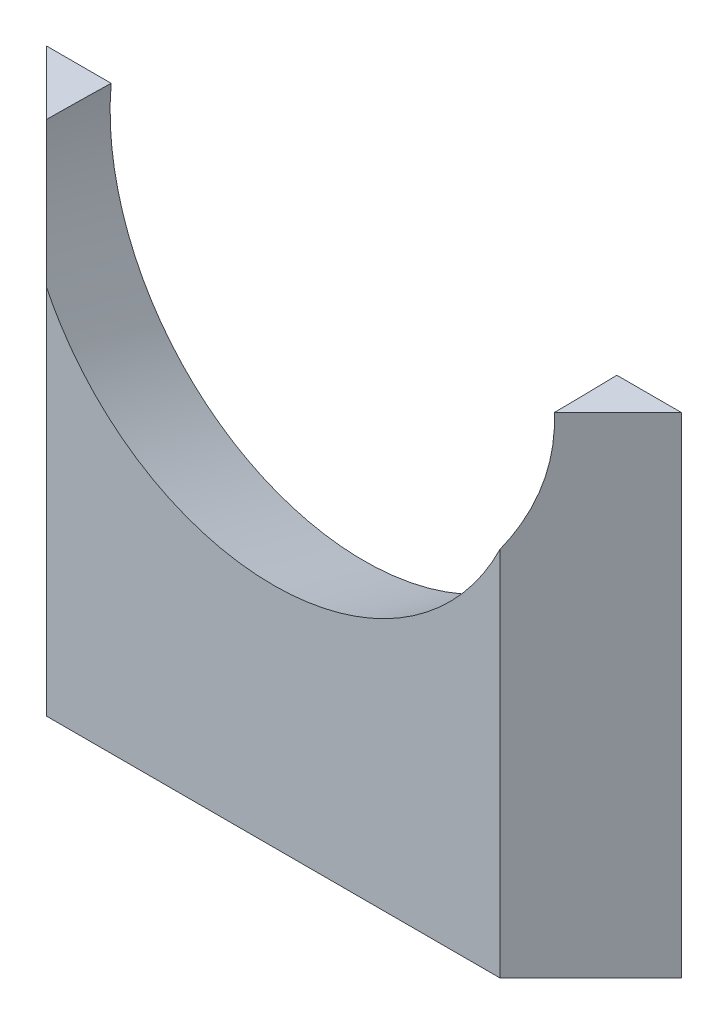
ISO-10303-21;
HEADER;
FILE_DESCRIPTION(('STEP AP214'),'2;1');
FILE_NAME('part.step','',(''),(''),'','','');
FILE_SCHEMA(('AUTOMOTIVE_DESIGN { 1 0 10303 214 1 1 1 1 }'));
ENDSEC;
DATA;
#1=APPLICATION_CONTEXT('core data for automotive mechanical design processes');
#2=APPLICATION_PROTOCOL_DEFINITION('international standard','automotive_design',2000,#1);
#3=PRODUCT_CONTEXT('',#1,'mechanical');
#4=PRODUCT('Part','Part','',(#3));
#5=PRODUCT_RELATED_PRODUCT_CATEGORY('part','',(#4));
#6=PRODUCT_DEFINITION_FORMATION('','',#4);
#7=PRODUCT_DEFINITION_CONTEXT('part definition',#1,'design');
#8=PRODUCT_DEFINITION('design','',#6,#7);
#9=PRODUCT_DEFINITION_SHAPE('','',#8);
#10=(LENGTH_UNIT() NAMED_UNIT(*) SI_UNIT(.MILLI.,.METRE.));
#11=(NAMED_UNIT(*) PLANE_ANGLE_UNIT() SI_UNIT($,.RADIAN.));
#12=(NAMED_UNIT(*) SI_UNIT($,.STERADIAN.) SOLID_ANGLE_UNIT());
#13=UNCERTAINTY_MEASURE_WITH_UNIT(LENGTH_MEASURE(1.E-05),#10,'distance_accuracy_value','');
#14=(GEOMETRIC_REPRESENTATION_CONTEXT(3) GLOBAL_UNCERTAINTY_ASSIGNED_CONTEXT((#13)) GLOBAL_UNIT_ASSIGNED_CONTEXT((#10,
#11,#12)) REPRESENTATION_CONTEXT('',''));
#15=CARTESIAN_POINT('',(0.,0.,0.));
#16=DIRECTION('',(0.,0.,1.));
#17=DIRECTION('',(1.,0.,0.));
#18=AXIS2_PLACEMENT_3D('',#15,#16,#17);
#19=CARTESIAN_POINT('',(0.,27.,0.));
#20=DIRECTION('',(0.,1.,0.));
#21=DIRECTION('',(0.,0.,1.));
#22=AXIS2_PLACEMENT_3D('',#19,#20,#21);
#23=PLANE('',#22);
#24=CARTESIAN_POINT('',(0.,27.,2.49999999999999));
#25=DIRECTION('',(0.,1.,0.));
#26=DIRECTION('',(0.,0.,1.));
#27=AXIS2_PLACEMENT_3D('',#24,#25,#26);
#28=ELLIPSE('',#27,54.0918462721884,14.);
#29=CARTESIAN_POINT('',(13.9946543699012,27.,1.00534563009877));
#30=VERTEX_POINT('',#29);
#31=CARTESIAN_POINT('',(13.9400616048605,27.,-2.5));
#32=VERTEX_POINT('',#31);
#33=EDGE_CURVE('E11',#30,#32,#28,.T.);
#34=ORIENTED_EDGE('',*,*,#33,.F.);
#35=DIRECTION('',(0.707106781186547,0.,-0.707106781186548));
#36=VECTOR('',#35,1.);
#37=CARTESIAN_POINT('',(17.5,27.,-2.5));
#38=LINE('',#37,#36);
#39=CARTESIAN_POINT('',(17.5,27.,-2.5));
#40=VERTEX_POINT('',#39);
#41=EDGE_CURVE('E148',#30,#40,#38,.T.);
#42=ORIENTED_EDGE('',*,*,#41,.T.);
#43=DIRECTION('',(-1.,0.,0.));
#44=VECTOR('',#43,1.);
#45=CARTESIAN_POINT('',(-17.5,27.,-2.5));
#46=LINE('',#45,#44);
#47=EDGE_CURVE('E107',#40,#32,#46,.T.);
#48=ORIENTED_EDGE('',*,*,#47,.T.);
#49=EDGE_LOOP('',(#34,#42,#48));
#50=FACE_BOUND('',#49,.T.);
#51=ADVANCED_FACE('F43',(#50),#23,.T.);
#52=CARTESIAN_POINT('',(-12.5,27.,2.5));
#53=DIRECTION('',(0.707106781186548,0.,-0.707106781186547));
#54=DIRECTION('',(-0.707106781186547,0.,-0.707106781186548));
#55=AXIS2_PLACEMENT_3D('',#52,#53,#54);
#56=PLANE('',#55);
#57=DIRECTION('',(0.,-1.,0.));
#58=VECTOR('',#57,1.);
#59=CARTESIAN_POINT('',(-12.5,27.,2.5));
#60=LINE('',#59,#58);
#61=CARTESIAN_POINT('',(-12.5,20.472832038583,2.5));
#62=VERTEX_POINT('',#61);
#63=CARTESIAN_POINT('',(-12.5,0.,2.5));
#64=VERTEX_POINT('',#63);
#65=EDGE_CURVE('E131',#62,#64,#60,.T.);
#66=ORIENTED_EDGE('',*,*,#65,.F.);
#67=CARTESIAN_POINT('',(0.,30.349364905389,15.));
#68=DIRECTION('',(0.707106781186548,0.,-0.707106781186547));
#69=DIRECTION('',(0.661224832946646,0.354349320006911,0.661224832946646));
#70=AXIS2_PLACEMENT_3D('',#67,#68,#69);
#71=ELLIPSE('',#70,20.4974226119285,14.);
#72=CARTESIAN_POINT('',(-13.9946543699012,27.,1.00534563009878));
#73=VERTEX_POINT('',#72);
#74=EDGE_CURVE('E141',#62,#73,#71,.T.);
#75=ORIENTED_EDGE('',*,*,#74,.T.);
#76=DIRECTION('',(0.707106781186548,0.,0.707106781186548));
#77=VECTOR('',#76,1.);
#78=CARTESIAN_POINT('',(-12.5,27.,2.5));
#79=LINE('',#78,#77);
#80=CARTESIAN_POINT('',(-17.5,27.,-2.5));
#81=VERTEX_POINT('',#80);
#82=EDGE_CURVE('E98',#81,#73,#79,.T.);
#83=ORIENTED_EDGE('',*,*,#82,.F.);
#84=DIRECTION('',(0.,-1.,0.));
#85=VECTOR('',#84,1.);
#86=CARTESIAN_POINT('',(-17.5,27.,-2.5));
#87=LINE('',#86,#85);
#88=CARTESIAN_POINT('',(-17.5,0.,-2.5));
#89=VERTEX_POINT('',#88);
#90=EDGE_CURVE('E89',#81,#89,#87,.T.);
#91=ORIENTED_EDGE('',*,*,#90,.T.);
#92=DIRECTION('',(0.707106781186548,0.,0.707106781186548));
#93=VECTOR('',#92,1.);
#94=CARTESIAN_POINT('',(-12.5,0.,2.5));
#95=LINE('',#94,#93);
#96=EDGE_CURVE('E104',#89,#64,#95,.T.);
#97=ORIENTED_EDGE('',*,*,#96,.T.);
#98=EDGE_LOOP('',(#66,#75,#83,#91,#97));
#99=FACE_BOUND('',#98,.T.);
#100=ADVANCED_FACE('F45',(#99),#56,.F.);
#101=CARTESIAN_POINT('',(12.5,27.,2.5));
#102=DIRECTION('',(0.,0.,-1.));
#103=DIRECTION('',(-1.,0.,0.));
#104=AXIS2_PLACEMENT_3D('',#101,#102,#103);
#105=PLANE('',#104);
#106=DIRECTION('',(0.,-1.,0.));
#107=VECTOR('',#106,1.);
#108=CARTESIAN_POINT('',(12.5,27.,2.5));
#109=LINE('',#108,#107);
#110=CARTESIAN_POINT('',(12.5,20.472832038583,2.5));
#111=VERTEX_POINT('',#110);
#112=CARTESIAN_POINT('',(12.5,0.,2.5));
#113=VERTEX_POINT('',#112);
#114=EDGE_CURVE('E129',#111,#113,#109,.T.);
#115=ORIENTED_EDGE('',*,*,#114,.F.);
#116=CARTESIAN_POINT('',(0.,27.,2.5));
#117=DIRECTION('',(0.,0.,-1.));
#118=DIRECTION('',(0.,1.,0.));
#119=AXIS2_PLACEMENT_3D('',#116,#117,#118);
#120=ELLIPSE('',#119,14.4938665257411,14.);
#121=EDGE_CURVE('E114',#111,#62,#120,.T.);
#122=ORIENTED_EDGE('',*,*,#121,.T.);
#123=ORIENTED_EDGE('',*,*,#65,.T.);
#124=DIRECTION('',(1.,0.,0.));
#125=VECTOR('',#124,1.);
#126=CARTESIAN_POINT('',(12.5,0.,2.5));
#127=LINE('',#126,#125);
#128=EDGE_CURVE('E112',#64,#113,#127,.T.);
#129=ORIENTED_EDGE('',*,*,#128,.T.);
#130=EDGE_LOOP('',(#115,#122,#123,#129));
#131=FACE_BOUND('',#130,.T.);
#132=ADVANCED_FACE('F167',(#131),#105,.F.);
#133=CARTESIAN_POINT('',(17.5,27.,-2.5));
#134=DIRECTION('',(-0.707106781186548,0.,-0.707106781186547));
#135=DIRECTION('',(-0.707106781186547,0.,0.707106781186548));
#136=AXIS2_PLACEMENT_3D('',#133,#134,#135);
#137=PLANE('',#136);
#138=ORIENTED_EDGE('',*,*,#41,.F.);
#139=CARTESIAN_POINT('',(0.,30.349364905389,15.));
#140=DIRECTION('',(-0.707106781186548,0.,-0.707106781186547));
#141=DIRECTION('',(-0.661224832946646,0.354349320006911,0.661224832946646));
#142=AXIS2_PLACEMENT_3D('',#139,#140,#141);
#143=ELLIPSE('',#142,20.4974226119285,14.);
#144=EDGE_CURVE('E120',#30,#111,#143,.T.);
#145=ORIENTED_EDGE('',*,*,#144,.T.);
#146=ORIENTED_EDGE('',*,*,#114,.T.);
#147=DIRECTION('',(0.707106781186547,0.,-0.707106781186548));
#148=VECTOR('',#147,1.);
#149=CARTESIAN_POINT('',(17.5,0.,-2.5));
#150=LINE('',#149,#148);
#151=CARTESIAN_POINT('',(17.5,0.,-2.5));
#152=VERTEX_POINT('',#151);
#153=EDGE_CURVE('E99',#113,#152,#150,.T.);
#154=ORIENTED_EDGE('',*,*,#153,.T.);
#155=DIRECTION('',(0.,-1.,0.));
#156=VECTOR('',#155,1.);
#157=CARTESIAN_POINT('',(17.5,27.,-2.5));
#158=LINE('',#157,#156);
#159=EDGE_CURVE('E93',#40,#152,#158,.T.);
#160=ORIENTED_EDGE('',*,*,#159,.F.);
#161=EDGE_LOOP('',(#138,#145,#146,#154,#160));
#162=FACE_BOUND('',#161,.T.);
#163=ADVANCED_FACE('F165',(#162),#137,.F.);
#164=CARTESIAN_POINT('',(-17.5,27.,-2.5));
#165=DIRECTION('',(0.,0.,1.));
#166=DIRECTION('',(1.,0.,0.));
#167=AXIS2_PLACEMENT_3D('',#164,#165,#166);
#168=PLANE('',#167);
#169=CARTESIAN_POINT('',(-13.9400616048605,27.,-2.5));
#170=VERTEX_POINT('',#169);
#171=EDGE_CURVE('E66',#170,#81,#46,.T.);
#172=ORIENTED_EDGE('',*,*,#171,.F.);
#173=CARTESIAN_POINT('',(0.,25.6602540378444,-2.5));
#174=DIRECTION('',(0.,0.,1.));
#175=DIRECTION('',(0.,1.,0.));
#176=AXIS2_PLACEMENT_3D('',#173,#174,#175);
#177=ELLIPSE('',#176,14.4938665257411,14.);
#178=EDGE_CURVE('E58',#170,#32,#177,.T.);
#179=ORIENTED_EDGE('',*,*,#178,.T.);
#180=ORIENTED_EDGE('',*,*,#47,.F.);
#181=ORIENTED_EDGE('',*,*,#159,.T.);
#182=DIRECTION('',(-1.,0.,0.));
#183=VECTOR('',#182,1.);
#184=CARTESIAN_POINT('',(-17.5,0.,-2.5));
#185=LINE('',#184,#183);
#186=EDGE_CURVE('E86',#152,#89,#185,.T.);
#187=ORIENTED_EDGE('',*,*,#186,.T.);
#188=ORIENTED_EDGE('',*,*,#90,.F.);
#189=EDGE_LOOP('',(#172,#179,#180,#181,#187,#188));
#190=FACE_BOUND('',#189,.T.);
#191=ADVANCED_FACE('F88',(#190),#168,.F.);
#192=EDGE_CURVE('E47',#170,#73,#28,.T.);
#193=ORIENTED_EDGE('',*,*,#192,.F.);
#194=ORIENTED_EDGE('',*,*,#171,.T.);
#195=ORIENTED_EDGE('',*,*,#82,.T.);
#196=EDGE_LOOP('',(#193,#194,#195));
#197=FACE_BOUND('',#196,.T.);
#198=ADVANCED_FACE('F146',(#197),#23,.T.);
#199=CARTESIAN_POINT('',(0.,0.,0.));
#200=DIRECTION('',(0.,1.,0.));
#201=DIRECTION('',(0.,0.,1.));
#202=AXIS2_PLACEMENT_3D('',#199,#200,#201);
#203=PLANE('',#202);
#204=ORIENTED_EDGE('',*,*,#96,.F.);
#205=ORIENTED_EDGE('',*,*,#186,.F.);
#206=ORIENTED_EDGE('',*,*,#153,.F.);
#207=ORIENTED_EDGE('',*,*,#128,.F.);
#208=EDGE_LOOP('',(#204,#205,#206,#207));
#209=FACE_BOUND('',#208,.T.);
#210=ADVANCED_FACE('F110',(#209),#203,.F.);
#211=CARTESIAN_POINT('',(0.,23.94134295109,-8.91506350946104));
#212=DIRECTION('',(0.,0.258819045102518,0.965925826289069));
#213=DIRECTION('',(0.,-0.965925826289069,0.258819045102518));
#214=AXIS2_PLACEMENT_3D('',#211,#212,#213);
#215=CYLINDRICAL_SURFACE('',#214,14.);
#216=ORIENTED_EDGE('',*,*,#144,.F.);
#217=ORIENTED_EDGE('',*,*,#33,.T.);
#218=ORIENTED_EDGE('',*,*,#178,.F.);
#219=ORIENTED_EDGE('',*,*,#192,.T.);
#220=ORIENTED_EDGE('',*,*,#74,.F.);
#221=ORIENTED_EDGE('',*,*,#121,.F.);
#222=EDGE_LOOP('',(#216,#217,#218,#219,#220,#221));
#223=FACE_BOUND('',#222,.T.);
#224=ADVANCED_FACE('F138',(#223),#215,.F.);
#225=CLOSED_SHELL('',(#51,#100,#132,#163,#191,#198,#210,#224));
#226=MANIFOLD_SOLID_BREP('B2',#225);
#227=ADVANCED_BREP_SHAPE_REPRESENTATION('',(#18,#226),#14);
#228=SHAPE_DEFINITION_REPRESENTATION(#9,#227);
ENDSEC;
END-ISO-10303-21;
